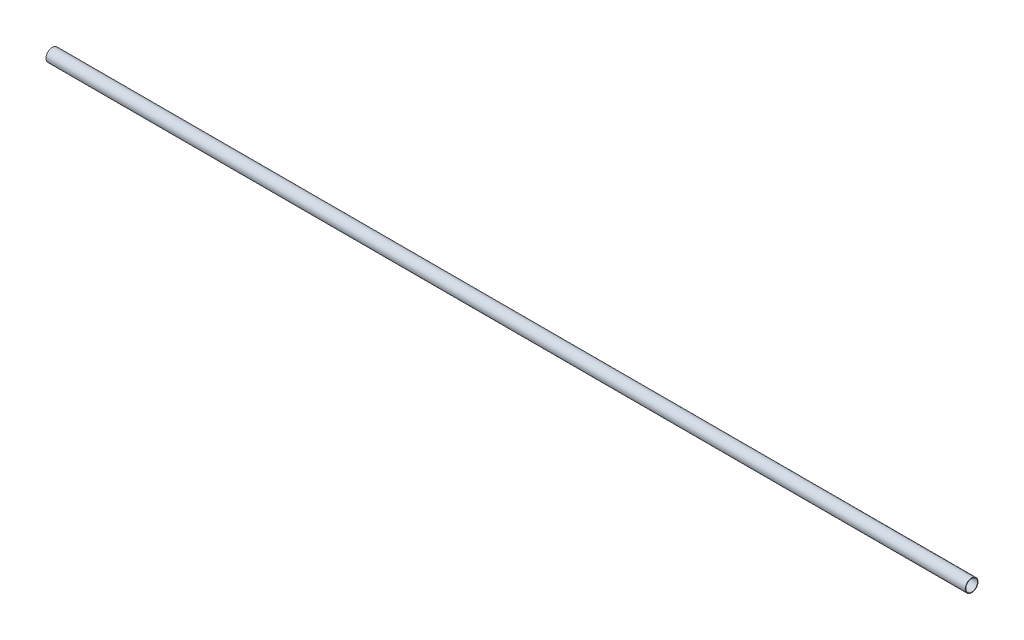
ISO-10303-21;
HEADER;
FILE_DESCRIPTION(('STEP AP214'),'2;1');
FILE_NAME('part.step','',(''),(''),'','','');
FILE_SCHEMA(('AUTOMOTIVE_DESIGN { 1 0 10303 214 1 1 1 1 }'));
ENDSEC;
DATA;
#1=APPLICATION_CONTEXT('core data for automotive mechanical design processes');
#2=APPLICATION_PROTOCOL_DEFINITION('international standard','automotive_design',2000,#1);
#3=PRODUCT_CONTEXT('',#1,'mechanical');
#4=PRODUCT('Part','Part','',(#3));
#5=PRODUCT_RELATED_PRODUCT_CATEGORY('part','',(#4));
#6=PRODUCT_DEFINITION_FORMATION('','',#4);
#7=PRODUCT_DEFINITION_CONTEXT('part definition',#1,'design');
#8=PRODUCT_DEFINITION('design','',#6,#7);
#9=PRODUCT_DEFINITION_SHAPE('','',#8);
#10=(LENGTH_UNIT() NAMED_UNIT(*) SI_UNIT(.MILLI.,.METRE.));
#11=(NAMED_UNIT(*) PLANE_ANGLE_UNIT() SI_UNIT($,.RADIAN.));
#12=(NAMED_UNIT(*) SI_UNIT($,.STERADIAN.) SOLID_ANGLE_UNIT());
#13=UNCERTAINTY_MEASURE_WITH_UNIT(LENGTH_MEASURE(1.E-05),#10,'distance_accuracy_value','');
#14=(GEOMETRIC_REPRESENTATION_CONTEXT(3) GLOBAL_UNCERTAINTY_ASSIGNED_CONTEXT((#13)) GLOBAL_UNIT_ASSIGNED_CONTEXT((#10,
#11,#12)) REPRESENTATION_CONTEXT('',''));
#15=CARTESIAN_POINT('',(0.,0.,0.));
#16=DIRECTION('',(0.,0.,1.));
#17=DIRECTION('',(1.,0.,0.));
#18=AXIS2_PLACEMENT_3D('',#15,#16,#17);
#19=CARTESIAN_POINT('',(457.2,0.,0.));
#20=DIRECTION('',(1.,0.,0.));
#21=DIRECTION('',(0.,0.,-1.));
#22=AXIS2_PLACEMENT_3D('',#19,#20,#21);
#23=PLANE('',#22);
#24=CARTESIAN_POINT('',(457.2,0.,0.));
#25=DIRECTION('',(1.,0.,0.));
#26=DIRECTION('',(0.,0.,-1.));
#27=AXIS2_PLACEMENT_3D('',#24,#25,#26);
#28=CIRCLE('',#27,6.35);
#29=CARTESIAN_POINT('',(457.2,0.,-6.35));
#30=VERTEX_POINT('',#29);
#31=EDGE_CURVE('E10',#30,#30,#28,.T.);
#32=ORIENTED_EDGE('',*,*,#31,.T.);
#33=EDGE_LOOP('',(#32));
#34=FACE_BOUND('',#33,.T.);
#35=CARTESIAN_POINT('',(457.2,0.,0.));
#36=DIRECTION('',(1.,0.,0.));
#37=DIRECTION('',(0.,0.,-1.));
#38=AXIS2_PLACEMENT_3D('',#35,#36,#37);
#39=CIRCLE('',#38,5.842);
#40=CARTESIAN_POINT('',(457.2,0.,-5.842));
#41=VERTEX_POINT('',#40);
#42=EDGE_CURVE('E41',#41,#41,#39,.T.);
#43=ORIENTED_EDGE('',*,*,#42,.F.);
#44=EDGE_LOOP('',(#43));
#45=FACE_BOUND('',#44,.T.);
#46=ADVANCED_FACE('F30',(#34,#45),#23,.T.);
#47=CARTESIAN_POINT('',(-457.2,0.,0.));
#48=DIRECTION('',(1.,0.,0.));
#49=DIRECTION('',(0.,0.,-1.));
#50=AXIS2_PLACEMENT_3D('',#47,#48,#49);
#51=PLANE('',#50);
#52=CARTESIAN_POINT('',(-457.2,0.,0.));
#53=DIRECTION('',(1.,0.,0.));
#54=DIRECTION('',(0.,0.,-1.));
#55=AXIS2_PLACEMENT_3D('',#52,#53,#54);
#56=CIRCLE('',#55,6.35);
#57=CARTESIAN_POINT('',(-457.2,0.,-6.35));
#58=VERTEX_POINT('',#57);
#59=EDGE_CURVE('E34',#58,#58,#56,.T.);
#60=ORIENTED_EDGE('',*,*,#59,.F.);
#61=EDGE_LOOP('',(#60));
#62=FACE_BOUND('',#61,.T.);
#63=CARTESIAN_POINT('',(-457.2,0.,0.));
#64=DIRECTION('',(1.,0.,0.));
#65=DIRECTION('',(0.,0.,-1.));
#66=AXIS2_PLACEMENT_3D('',#63,#64,#65);
#67=CIRCLE('',#66,5.842);
#68=CARTESIAN_POINT('',(-457.2,0.,-5.842));
#69=VERTEX_POINT('',#68);
#70=EDGE_CURVE('E43',#69,#69,#67,.T.);
#71=ORIENTED_EDGE('',*,*,#70,.T.);
#72=EDGE_LOOP('',(#71));
#73=FACE_BOUND('',#72,.T.);
#74=ADVANCED_FACE('F53',(#62,#73),#51,.F.);
#75=CARTESIAN_POINT('',(457.2,0.,0.));
#76=DIRECTION('',(-1.,0.,0.));
#77=DIRECTION('',(0.,0.,1.));
#78=AXIS2_PLACEMENT_3D('',#75,#76,#77);
#79=CYLINDRICAL_SURFACE('',#78,6.35);
#80=ORIENTED_EDGE('',*,*,#31,.F.);
#81=EDGE_LOOP('',(#80));
#82=FACE_BOUND('',#81,.T.);
#83=ORIENTED_EDGE('',*,*,#59,.T.);
#84=EDGE_LOOP('',(#83));
#85=FACE_BOUND('',#84,.T.);
#86=ADVANCED_FACE('F32',(#82,#85),#79,.T.);
#87=CARTESIAN_POINT('',(457.2,0.,0.));
#88=DIRECTION('',(-1.,0.,0.));
#89=DIRECTION('',(0.,0.,1.));
#90=AXIS2_PLACEMENT_3D('',#87,#88,#89);
#91=CYLINDRICAL_SURFACE('',#90,5.842);
#92=ORIENTED_EDGE('',*,*,#42,.T.);
#93=EDGE_LOOP('',(#92));
#94=FACE_BOUND('',#93,.T.);
#95=ORIENTED_EDGE('',*,*,#70,.F.);
#96=EDGE_LOOP('',(#95));
#97=FACE_BOUND('',#96,.T.);
#98=ADVANCED_FACE('F49',(#94,#97),#91,.F.);
#99=CLOSED_SHELL('',(#46,#74,#86,#98));
#100=MANIFOLD_SOLID_BREP('B2',#99);
#101=ADVANCED_BREP_SHAPE_REPRESENTATION('',(#18,#100),#14);
#102=SHAPE_DEFINITION_REPRESENTATION(#9,#101);
ENDSEC;
END-ISO-10303-21;
